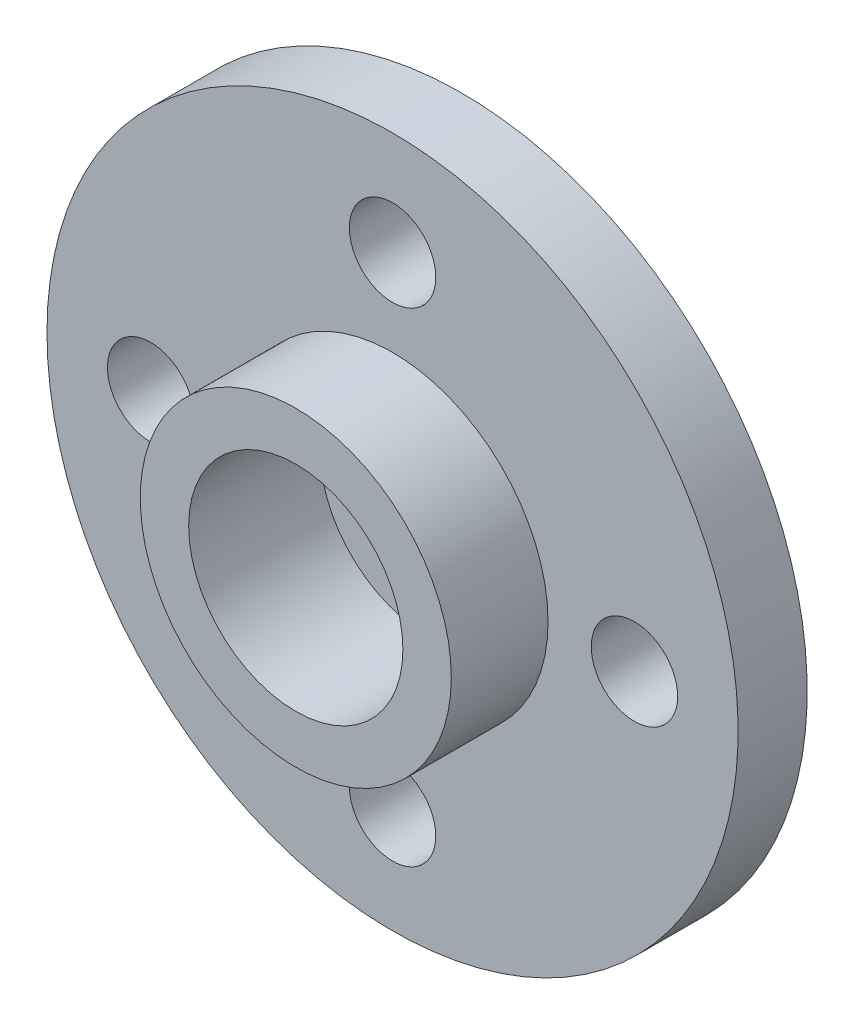
ISO-10303-21;
HEADER;
FILE_DESCRIPTION(('STEP AP214'),'2;1');
FILE_NAME('part.step','',(''),(''),'','','');
FILE_SCHEMA(('AUTOMOTIVE_DESIGN { 1 0 10303 214 1 1 1 1 }'));
ENDSEC;
DATA;
#1=APPLICATION_CONTEXT('core data for automotive mechanical design processes');
#2=APPLICATION_PROTOCOL_DEFINITION('international standard','automotive_design',2000,#1);
#3=PRODUCT_CONTEXT('',#1,'mechanical');
#4=PRODUCT('Part','Part','',(#3));
#5=PRODUCT_RELATED_PRODUCT_CATEGORY('part','',(#4));
#6=PRODUCT_DEFINITION_FORMATION('','',#4);
#7=PRODUCT_DEFINITION_CONTEXT('part definition',#1,'design');
#8=PRODUCT_DEFINITION('design','',#6,#7);
#9=PRODUCT_DEFINITION_SHAPE('','',#8);
#10=(LENGTH_UNIT() NAMED_UNIT(*) SI_UNIT(.MILLI.,.METRE.));
#11=(NAMED_UNIT(*) PLANE_ANGLE_UNIT() SI_UNIT($,.RADIAN.));
#12=(NAMED_UNIT(*) SI_UNIT($,.STERADIAN.) SOLID_ANGLE_UNIT());
#13=UNCERTAINTY_MEASURE_WITH_UNIT(LENGTH_MEASURE(1.E-05),#10,'distance_accuracy_value','');
#14=(GEOMETRIC_REPRESENTATION_CONTEXT(3) GLOBAL_UNCERTAINTY_ASSIGNED_CONTEXT((#13)) GLOBAL_UNIT_ASSIGNED_CONTEXT((#10,
#11,#12)) REPRESENTATION_CONTEXT('',''));
#15=CARTESIAN_POINT('',(0.,0.,0.));
#16=DIRECTION('',(0.,0.,1.));
#17=DIRECTION('',(1.,0.,0.));
#18=AXIS2_PLACEMENT_3D('',#15,#16,#17);
#19=CARTESIAN_POINT('',(-39.10264651977,-19.8999981269,-36.124));
#20=DIRECTION('',(0.,0.,-1.));
#21=DIRECTION('',(-1.,0.,0.));
#22=AXIS2_PLACEMENT_3D('',#19,#20,#21);
#23=PLANE('',#22);
#24=CARTESIAN_POINT('',(-39.10264651977,-19.8999981269,-36.124));
#25=DIRECTION('',(0.,0.,-1.));
#26=DIRECTION('',(-1.,0.,0.));
#27=AXIS2_PLACEMENT_3D('',#24,#25,#26);
#28=CIRCLE('',#27,10.);
#29=CARTESIAN_POINT('',(-49.10264651977,-19.8999981269,-36.124));
#30=VERTEX_POINT('',#29);
#31=EDGE_CURVE('E57',#30,#30,#28,.T.);
#32=ORIENTED_EDGE('',*,*,#31,.T.);
#33=EDGE_LOOP('',(#32));
#34=FACE_BOUND('',#33,.T.);
#35=CARTESIAN_POINT('',(-46.10264839287,-19.8999981269,-36.124));
#36=DIRECTION('',(0.,0.,1.));
#37=DIRECTION('',(1.,0.,0.));
#38=AXIS2_PLACEMENT_3D('',#35,#36,#37);
#39=CIRCLE('',#38,1.24999999999999);
#40=CARTESIAN_POINT('',(-44.85264839287,-19.8999981269,-36.124));
#41=VERTEX_POINT('',#40);
#42=EDGE_CURVE('E67',#41,#41,#39,.T.);
#43=ORIENTED_EDGE('',*,*,#42,.T.);
#44=EDGE_LOOP('',(#43));
#45=FACE_BOUND('',#44,.T.);
#46=CARTESIAN_POINT('',(-39.10264651977,-12.8999962538,-36.124));
#47=DIRECTION('',(0.,0.,1.));
#48=DIRECTION('',(1.,0.,0.));
#49=AXIS2_PLACEMENT_3D('',#46,#47,#48);
#50=CIRCLE('',#49,1.24999999999999);
#51=CARTESIAN_POINT('',(-37.85264651977,-12.8999962538,-36.124));
#52=VERTEX_POINT('',#51);
#53=EDGE_CURVE('E77',#52,#52,#50,.T.);
#54=ORIENTED_EDGE('',*,*,#53,.T.);
#55=EDGE_LOOP('',(#54));
#56=FACE_BOUND('',#55,.T.);
#57=CARTESIAN_POINT('',(-32.10264464667,-19.8999981269,-36.124));
#58=DIRECTION('',(0.,0.,1.));
#59=DIRECTION('',(1.,0.,0.));
#60=AXIS2_PLACEMENT_3D('',#57,#58,#59);
#61=CIRCLE('',#60,1.24999999999999);
#62=CARTESIAN_POINT('',(-30.85264464667,-19.8999981269,-36.124));
#63=VERTEX_POINT('',#62);
#64=EDGE_CURVE('E87',#63,#63,#61,.T.);
#65=ORIENTED_EDGE('',*,*,#64,.T.);
#66=EDGE_LOOP('',(#65));
#67=FACE_BOUND('',#66,.T.);
#68=CARTESIAN_POINT('',(-39.10264651977,-26.9,-36.124));
#69=DIRECTION('',(0.,0.,1.));
#70=DIRECTION('',(1.,0.,0.));
#71=AXIS2_PLACEMENT_3D('',#68,#69,#70);
#72=CIRCLE('',#71,1.24999999999999);
#73=CARTESIAN_POINT('',(-37.85264651977,-26.9,-36.124));
#74=VERTEX_POINT('',#73);
#75=EDGE_CURVE('E95',#74,#74,#72,.T.);
#76=ORIENTED_EDGE('',*,*,#75,.T.);
#77=EDGE_LOOP('',(#76));
#78=FACE_BOUND('',#77,.T.);
#79=CARTESIAN_POINT('',(-39.10264651977,-19.8999981269,-36.124));
#80=DIRECTION('',(0.,0.,1.));
#81=DIRECTION('',(1.,0.,0.));
#82=AXIS2_PLACEMENT_3D('',#79,#80,#81);
#83=CIRCLE('',#82,1.60000000000001);
#84=CARTESIAN_POINT('',(-37.50264651977,-19.8999981269,-36.124));
#85=VERTEX_POINT('',#84);
#86=EDGE_CURVE('E103',#85,#85,#83,.T.);
#87=ORIENTED_EDGE('',*,*,#86,.T.);
#88=EDGE_LOOP('',(#87));
#89=FACE_BOUND('',#88,.T.);
#90=ADVANCED_FACE('F43',(#34,#45,#56,#67,#78,#89),#23,.T.);
#91=CARTESIAN_POINT('',(-39.10264651977,-19.8999981269,-34.124));
#92=DIRECTION('',(0.,0.,-1.));
#93=DIRECTION('',(-1.,0.,0.));
#94=AXIS2_PLACEMENT_3D('',#91,#92,#93);
#95=CYLINDRICAL_SURFACE('',#94,10.);
#96=CARTESIAN_POINT('',(-39.10264651977,-19.8999981269,-34.124));
#97=DIRECTION('',(0.,0.,-1.));
#98=DIRECTION('',(-1.,0.,0.));
#99=AXIS2_PLACEMENT_3D('',#96,#97,#98);
#100=CIRCLE('',#99,10.);
#101=CARTESIAN_POINT('',(-49.10264651977,-19.8999981269,-34.124));
#102=VERTEX_POINT('',#101);
#103=EDGE_CURVE('E47',#102,#102,#100,.T.);
#104=ORIENTED_EDGE('',*,*,#103,.T.);
#105=EDGE_LOOP('',(#104));
#106=FACE_BOUND('',#105,.T.);
#107=ORIENTED_EDGE('',*,*,#31,.F.);
#108=EDGE_LOOP('',(#107));
#109=FACE_BOUND('',#108,.T.);
#110=ADVANCED_FACE('F45',(#106,#109),#95,.T.);
#111=CARTESIAN_POINT('',(-29.10264651977,-19.8999981269,-34.124));
#112=DIRECTION('',(0.,0.,1.));
#113=DIRECTION('',(1.,0.,0.));
#114=AXIS2_PLACEMENT_3D('',#111,#112,#113);
#115=PLANE('',#114);
#116=CARTESIAN_POINT('',(-39.10264651977,-26.9,-34.124));
#117=DIRECTION('',(0.,0.,1.));
#118=DIRECTION('',(1.,0.,0.));
#119=AXIS2_PLACEMENT_3D('',#116,#117,#118);
#120=CIRCLE('',#119,1.24999999999999);
#121=CARTESIAN_POINT('',(-37.85264651977,-26.9,-34.124));
#122=VERTEX_POINT('',#121);
#123=EDGE_CURVE('E99',#122,#122,#120,.T.);
#124=ORIENTED_EDGE('',*,*,#123,.F.);
#125=EDGE_LOOP('',(#124));
#126=FACE_BOUND('',#125,.T.);
#127=CARTESIAN_POINT('',(-32.10264464667,-19.8999981269,-34.124));
#128=DIRECTION('',(0.,0.,1.));
#129=DIRECTION('',(1.,0.,0.));
#130=AXIS2_PLACEMENT_3D('',#127,#128,#129);
#131=CIRCLE('',#130,1.24999999999999);
#132=CARTESIAN_POINT('',(-30.85264464667,-19.8999981269,-34.124));
#133=VERTEX_POINT('',#132);
#134=EDGE_CURVE('E91',#133,#133,#131,.T.);
#135=ORIENTED_EDGE('',*,*,#134,.F.);
#136=EDGE_LOOP('',(#135));
#137=FACE_BOUND('',#136,.T.);
#138=CARTESIAN_POINT('',(-39.10264651977,-12.8999962538,-34.124));
#139=DIRECTION('',(0.,0.,1.));
#140=DIRECTION('',(1.,0.,0.));
#141=AXIS2_PLACEMENT_3D('',#138,#139,#140);
#142=CIRCLE('',#141,1.24999999999999);
#143=CARTESIAN_POINT('',(-37.85264651977,-12.8999962538,-34.124));
#144=VERTEX_POINT('',#143);
#145=EDGE_CURVE('E83',#144,#144,#142,.T.);
#146=ORIENTED_EDGE('',*,*,#145,.F.);
#147=EDGE_LOOP('',(#146));
#148=FACE_BOUND('',#147,.T.);
#149=CARTESIAN_POINT('',(-46.10264839287,-19.8999981269,-34.124));
#150=DIRECTION('',(0.,0.,1.));
#151=DIRECTION('',(1.,0.,0.));
#152=AXIS2_PLACEMENT_3D('',#149,#150,#151);
#153=CIRCLE('',#152,1.24999999999999);
#154=CARTESIAN_POINT('',(-44.85264839287,-19.8999981269,-34.124));
#155=VERTEX_POINT('',#154);
#156=EDGE_CURVE('E72',#155,#155,#153,.T.);
#157=ORIENTED_EDGE('',*,*,#156,.F.);
#158=EDGE_LOOP('',(#157));
#159=FACE_BOUND('',#158,.T.);
#160=CARTESIAN_POINT('',(-39.10264651977,-19.8999981269,-34.124));
#161=DIRECTION('',(0.,0.,1.));
#162=DIRECTION('',(1.,0.,0.));
#163=AXIS2_PLACEMENT_3D('',#160,#161,#162);
#164=CIRCLE('',#163,4.5);
#165=CARTESIAN_POINT('',(-34.60264651977,-19.8999981269,-34.124));
#166=VERTEX_POINT('',#165);
#167=EDGE_CURVE('E10',#166,#166,#164,.T.);
#168=ORIENTED_EDGE('',*,*,#167,.F.);
#169=EDGE_LOOP('',(#168));
#170=FACE_BOUND('',#169,.T.);
#171=ORIENTED_EDGE('',*,*,#103,.F.);
#172=EDGE_LOOP('',(#171));
#173=FACE_BOUND('',#172,.T.);
#174=ADVANCED_FACE('F136',(#126,#137,#148,#159,#170,#173),#115,.T.);
#175=CARTESIAN_POINT('',(-39.10264651977,-19.8999981269,-31.324));
#176=DIRECTION('',(0.,0.,-1.));
#177=DIRECTION('',(-1.,0.,0.));
#178=AXIS2_PLACEMENT_3D('',#175,#176,#177);
#179=CYLINDRICAL_SURFACE('',#178,4.5);
#180=CARTESIAN_POINT('',(-39.10264651977,-19.8999981269,-31.324));
#181=DIRECTION('',(0.,0.,1.));
#182=DIRECTION('',(1.,0.,0.));
#183=AXIS2_PLACEMENT_3D('',#180,#181,#182);
#184=CIRCLE('',#183,4.5);
#185=CARTESIAN_POINT('',(-34.60264651977,-19.8999981269,-31.324));
#186=VERTEX_POINT('',#185);
#187=EDGE_CURVE('E59',#186,#186,#184,.T.);
#188=ORIENTED_EDGE('',*,*,#187,.F.);
#189=EDGE_LOOP('',(#188));
#190=FACE_BOUND('',#189,.T.);
#191=ORIENTED_EDGE('',*,*,#167,.T.);
#192=EDGE_LOOP('',(#191));
#193=FACE_BOUND('',#192,.T.);
#194=ADVANCED_FACE('F125',(#190,#193),#179,.T.);
#195=CARTESIAN_POINT('',(-39.10264651977,-19.8999981269,-31.324));
#196=DIRECTION('',(0.,0.,1.));
#197=DIRECTION('',(1.,0.,0.));
#198=AXIS2_PLACEMENT_3D('',#195,#196,#197);
#199=PLANE('',#198);
#200=CARTESIAN_POINT('',(-39.10264651977,-19.8999981269,-31.324));
#201=DIRECTION('',(0.,0.,1.));
#202=DIRECTION('',(1.,0.,0.));
#203=AXIS2_PLACEMENT_3D('',#200,#201,#202);
#204=CIRCLE('',#203,3.09999999999999);
#205=CARTESIAN_POINT('',(-36.00264651977,-19.8999981269,-31.324));
#206=VERTEX_POINT('',#205);
#207=EDGE_CURVE('E115',#206,#206,#204,.T.);
#208=ORIENTED_EDGE('',*,*,#207,.F.);
#209=EDGE_LOOP('',(#208));
#210=FACE_BOUND('',#209,.T.);
#211=ORIENTED_EDGE('',*,*,#187,.T.);
#212=EDGE_LOOP('',(#211));
#213=FACE_BOUND('',#212,.T.);
#214=ADVANCED_FACE('F122',(#210,#213),#199,.T.);
#215=CARTESIAN_POINT('',(-46.10264839287,-19.8999981269,-34.124));
#216=DIRECTION('',(0.,0.,1.));
#217=DIRECTION('',(1.,0.,0.));
#218=AXIS2_PLACEMENT_3D('',#215,#216,#217);
#219=CYLINDRICAL_SURFACE('',#218,1.24999999999999);
#220=ORIENTED_EDGE('',*,*,#42,.F.);
#221=EDGE_LOOP('',(#220));
#222=FACE_BOUND('',#221,.T.);
#223=ORIENTED_EDGE('',*,*,#156,.T.);
#224=EDGE_LOOP('',(#223));
#225=FACE_BOUND('',#224,.T.);
#226=ADVANCED_FACE('F124',(#222,#225),#219,.F.);
#227=CARTESIAN_POINT('',(-39.10264651977,-12.8999962538,-34.124));
#228=DIRECTION('',(0.,0.,1.));
#229=DIRECTION('',(1.,0.,0.));
#230=AXIS2_PLACEMENT_3D('',#227,#228,#229);
#231=CYLINDRICAL_SURFACE('',#230,1.24999999999999);
#232=ORIENTED_EDGE('',*,*,#53,.F.);
#233=EDGE_LOOP('',(#232));
#234=FACE_BOUND('',#233,.T.);
#235=ORIENTED_EDGE('',*,*,#145,.T.);
#236=EDGE_LOOP('',(#235));
#237=FACE_BOUND('',#236,.T.);
#238=ADVANCED_FACE('F132',(#234,#237),#231,.F.);
#239=CARTESIAN_POINT('',(-32.10264464667,-19.8999981269,-34.124));
#240=DIRECTION('',(0.,0.,1.));
#241=DIRECTION('',(1.,0.,0.));
#242=AXIS2_PLACEMENT_3D('',#239,#240,#241);
#243=CYLINDRICAL_SURFACE('',#242,1.24999999999999);
#244=ORIENTED_EDGE('',*,*,#64,.F.);
#245=EDGE_LOOP('',(#244));
#246=FACE_BOUND('',#245,.T.);
#247=ORIENTED_EDGE('',*,*,#134,.T.);
#248=EDGE_LOOP('',(#247));
#249=FACE_BOUND('',#248,.T.);
#250=ADVANCED_FACE('F163',(#246,#249),#243,.F.);
#251=CARTESIAN_POINT('',(-39.10264651977,-26.9,-34.124));
#252=DIRECTION('',(0.,0.,1.));
#253=DIRECTION('',(1.,0.,0.));
#254=AXIS2_PLACEMENT_3D('',#251,#252,#253);
#255=CYLINDRICAL_SURFACE('',#254,1.24999999999999);
#256=ORIENTED_EDGE('',*,*,#75,.F.);
#257=EDGE_LOOP('',(#256));
#258=FACE_BOUND('',#257,.T.);
#259=ORIENTED_EDGE('',*,*,#123,.T.);
#260=EDGE_LOOP('',(#259));
#261=FACE_BOUND('',#260,.T.);
#262=ADVANCED_FACE('F169',(#258,#261),#255,.F.);
#263=CARTESIAN_POINT('',(-39.10264651977,-19.8999981269,-31.324));
#264=DIRECTION('',(0.,0.,1.));
#265=DIRECTION('',(1.,0.,0.));
#266=AXIS2_PLACEMENT_3D('',#263,#264,#265);
#267=CYLINDRICAL_SURFACE('',#266,1.60000000000001);
#268=ORIENTED_EDGE('',*,*,#86,.F.);
#269=EDGE_LOOP('',(#268));
#270=FACE_BOUND('',#269,.T.);
#271=CARTESIAN_POINT('',(-39.10264651977,-19.8999981269,-35.124));
#272=DIRECTION('',(0.,0.,1.));
#273=DIRECTION('',(1.,0.,0.));
#274=AXIS2_PLACEMENT_3D('',#271,#272,#273);
#275=CIRCLE('',#274,1.60000000000001);
#276=CARTESIAN_POINT('',(-37.50264651977,-19.8999981269,-35.124));
#277=VERTEX_POINT('',#276);
#278=EDGE_CURVE('E107',#277,#277,#275,.T.);
#279=ORIENTED_EDGE('',*,*,#278,.T.);
#280=EDGE_LOOP('',(#279));
#281=FACE_BOUND('',#280,.T.);
#282=ADVANCED_FACE('F175',(#270,#281),#267,.F.);
#283=CARTESIAN_POINT('',(-37.50264651977,-19.8999981269,-35.124));
#284=DIRECTION('',(0.,0.,-1.));
#285=DIRECTION('',(-1.,0.,0.));
#286=AXIS2_PLACEMENT_3D('',#283,#284,#285);
#287=PLANE('',#286);
#288=ORIENTED_EDGE('',*,*,#278,.F.);
#289=EDGE_LOOP('',(#288));
#290=FACE_BOUND('',#289,.T.);
#291=CARTESIAN_POINT('',(-39.10264651977,-19.8999981269,-35.124));
#292=DIRECTION('',(0.,0.,1.));
#293=DIRECTION('',(1.,0.,0.));
#294=AXIS2_PLACEMENT_3D('',#291,#292,#293);
#295=CIRCLE('',#294,3.09999999999999);
#296=CARTESIAN_POINT('',(-36.00264651977,-19.8999981269,-35.124));
#297=VERTEX_POINT('',#296);
#298=EDGE_CURVE('E111',#297,#297,#295,.T.);
#299=ORIENTED_EDGE('',*,*,#298,.T.);
#300=EDGE_LOOP('',(#299));
#301=FACE_BOUND('',#300,.T.);
#302=ADVANCED_FACE('F178',(#290,#301),#287,.F.);
#303=CARTESIAN_POINT('',(-39.10264651977,-19.8999981269,-31.324));
#304=DIRECTION('',(0.,0.,1.));
#305=DIRECTION('',(1.,0.,0.));
#306=AXIS2_PLACEMENT_3D('',#303,#304,#305);
#307=CYLINDRICAL_SURFACE('',#306,3.09999999999999);
#308=ORIENTED_EDGE('',*,*,#298,.F.);
#309=EDGE_LOOP('',(#308));
#310=FACE_BOUND('',#309,.T.);
#311=ORIENTED_EDGE('',*,*,#207,.T.);
#312=EDGE_LOOP('',(#311));
#313=FACE_BOUND('',#312,.T.);
#314=ADVANCED_FACE('F120',(#310,#313),#307,.F.);
#315=CLOSED_SHELL('',(#90,#110,#174,#194,#214,#226,#238,#250,#262,#282,#302,#314));
#316=MANIFOLD_SOLID_BREP('B2',#315);
#317=ADVANCED_BREP_SHAPE_REPRESENTATION('',(#18,#316),#14);
#318=SHAPE_DEFINITION_REPRESENTATION(#9,#317);
ENDSEC;
END-ISO-10303-21;
